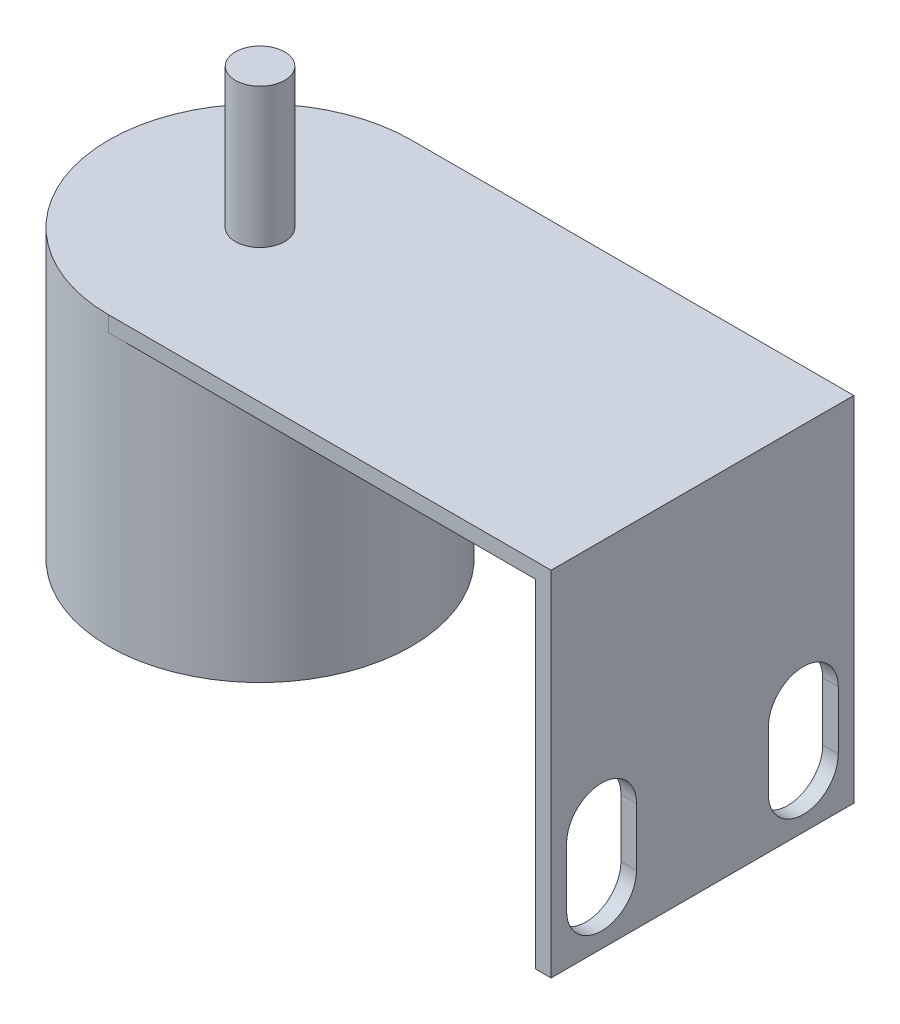
ISO-10303-21;
HEADER;
FILE_DESCRIPTION(('STEP AP214'),'2;1');
FILE_NAME('part.step','',(''),(''),'','','');
FILE_SCHEMA(('AUTOMOTIVE_DESIGN { 1 0 10303 214 1 1 1 1 }'));
ENDSEC;
DATA;
#1=APPLICATION_CONTEXT('core data for automotive mechanical design processes');
#2=APPLICATION_PROTOCOL_DEFINITION('international standard','automotive_design',2000,#1);
#3=PRODUCT_CONTEXT('',#1,'mechanical');
#4=PRODUCT('Part','Part','',(#3));
#5=PRODUCT_RELATED_PRODUCT_CATEGORY('part','',(#4));
#6=PRODUCT_DEFINITION_FORMATION('','',#4);
#7=PRODUCT_DEFINITION_CONTEXT('part definition',#1,'design');
#8=PRODUCT_DEFINITION('design','',#6,#7);
#9=PRODUCT_DEFINITION_SHAPE('','',#8);
#10=(LENGTH_UNIT() NAMED_UNIT(*) SI_UNIT(.MILLI.,.METRE.));
#11=(NAMED_UNIT(*) PLANE_ANGLE_UNIT() SI_UNIT($,.RADIAN.));
#12=(NAMED_UNIT(*) SI_UNIT($,.STERADIAN.) SOLID_ANGLE_UNIT());
#13=UNCERTAINTY_MEASURE_WITH_UNIT(LENGTH_MEASURE(1.E-05),#10,'distance_accuracy_value','');
#14=(GEOMETRIC_REPRESENTATION_CONTEXT(3) GLOBAL_UNCERTAINTY_ASSIGNED_CONTEXT((#13)) GLOBAL_UNIT_ASSIGNED_CONTEXT((#10,
#11,#12)) REPRESENTATION_CONTEXT('',''));
#15=CARTESIAN_POINT('',(0.,0.,0.));
#16=DIRECTION('',(0.,0.,1.));
#17=DIRECTION('',(1.,0.,0.));
#18=AXIS2_PLACEMENT_3D('',#15,#16,#17);
#19=CARTESIAN_POINT('',(0.,35.,0.));
#20=DIRECTION('',(0.,1.,0.));
#21=DIRECTION('',(0.,0.,1.));
#22=AXIS2_PLACEMENT_3D('',#19,#20,#21);
#23=PLANE('',#22);
#24=DIRECTION('',(0.,0.,-1.));
#25=VECTOR('',#24,1.);
#26=CARTESIAN_POINT('',(55.,35.,19.5));
#27=LINE('',#26,#25);
#28=CARTESIAN_POINT('',(55.,35.,19.5));
#29=VERTEX_POINT('',#28);
#30=CARTESIAN_POINT('',(55.,35.,-19.5));
#31=VERTEX_POINT('',#30);
#32=EDGE_CURVE('E169',#29,#31,#27,.T.);
#33=ORIENTED_EDGE('',*,*,#32,.F.);
#34=DIRECTION('',(1.,0.,0.));
#35=VECTOR('',#34,1.);
#36=CARTESIAN_POINT('',(0.,35.,19.5));
#37=LINE('',#36,#35);
#38=CARTESIAN_POINT('',(0.,35.,19.5));
#39=VERTEX_POINT('',#38);
#40=EDGE_CURVE('E206',#39,#29,#37,.T.);
#41=ORIENTED_EDGE('',*,*,#40,.F.);
#42=CARTESIAN_POINT('',(0.,35.,0.));
#43=DIRECTION('',(0.,1.,0.));
#44=DIRECTION('',(0.,0.,1.));
#45=AXIS2_PLACEMENT_3D('',#42,#43,#44);
#46=CIRCLE('',#45,19.5);
#47=CARTESIAN_POINT('',(0.,35.,-19.5));
#48=VERTEX_POINT('',#47);
#49=EDGE_CURVE('E235',#39,#48,#46,.T.);
#50=ORIENTED_EDGE('',*,*,#49,.T.);
#51=DIRECTION('',(-1.,0.,0.));
#52=VECTOR('',#51,1.);
#53=CARTESIAN_POINT('',(0.,35.,-19.5));
#54=LINE('',#53,#52);
#55=EDGE_CURVE('E211',#31,#48,#54,.T.);
#56=ORIENTED_EDGE('',*,*,#55,.F.);
#57=EDGE_LOOP('',(#33,#41,#50,#56));
#58=FACE_BOUND('',#57,.T.);
#59=ADVANCED_FACE('F37',(#58),#23,.F.);
#60=CARTESIAN_POINT('',(0.,35.,0.));
#61=DIRECTION('',(0.,-1.,0.));
#62=DIRECTION('',(0.,0.,-1.));
#63=AXIS2_PLACEMENT_3D('',#60,#61,#62);
#64=CYLINDRICAL_SURFACE('',#63,19.5);
#65=ORIENTED_EDGE('',*,*,#49,.F.);
#66=DIRECTION('',(0.,-1.,0.));
#67=VECTOR('',#66,1.);
#68=CARTESIAN_POINT('',(0.,37.,19.5));
#69=LINE('',#68,#67);
#70=CARTESIAN_POINT('',(0.,37.,19.5));
#71=VERTEX_POINT('',#70);
#72=EDGE_CURVE('E227',#71,#39,#69,.T.);
#73=ORIENTED_EDGE('',*,*,#72,.F.);
#74=CARTESIAN_POINT('',(0.,37.,0.));
#75=DIRECTION('',(0.,1.,0.));
#76=DIRECTION('',(0.,0.,1.));
#77=AXIS2_PLACEMENT_3D('',#74,#75,#76);
#78=CIRCLE('',#77,19.5);
#79=CARTESIAN_POINT('',(0.,37.,-19.5));
#80=VERTEX_POINT('',#79);
#81=EDGE_CURVE('E207',#80,#71,#78,.T.);
#82=ORIENTED_EDGE('',*,*,#81,.F.);
#83=DIRECTION('',(0.,-1.,0.));
#84=VECTOR('',#83,1.);
#85=CARTESIAN_POINT('',(0.,37.,-19.5));
#86=LINE('',#85,#84);
#87=EDGE_CURVE('E217',#80,#48,#86,.T.);
#88=ORIENTED_EDGE('',*,*,#87,.T.);
#89=EDGE_LOOP('',(#65,#73,#82,#88));
#90=FACE_BOUND('',#89,.T.);
#91=CARTESIAN_POINT('',(0.,0.,0.));
#92=DIRECTION('',(0.,1.,0.));
#93=DIRECTION('',(0.,0.,1.));
#94=AXIS2_PLACEMENT_3D('',#91,#92,#93);
#95=CIRCLE('',#94,19.5);
#96=CARTESIAN_POINT('',(0.,0.,19.5));
#97=VERTEX_POINT('',#96);
#98=EDGE_CURVE('E234',#97,#97,#95,.T.);
#99=ORIENTED_EDGE('',*,*,#98,.T.);
#100=EDGE_LOOP('',(#99));
#101=FACE_BOUND('',#100,.T.);
#102=ADVANCED_FACE('F39',(#90,#101),#64,.T.);
#103=CARTESIAN_POINT('',(0.,0.,0.));
#104=DIRECTION('',(0.,1.,0.));
#105=DIRECTION('',(0.,0.,1.));
#106=AXIS2_PLACEMENT_3D('',#103,#104,#105);
#107=PLANE('',#106);
#108=ORIENTED_EDGE('',*,*,#98,.F.);
#109=EDGE_LOOP('',(#108));
#110=FACE_BOUND('',#109,.T.);
#111=ADVANCED_FACE('F283',(#110),#107,.F.);
#112=CARTESIAN_POINT('',(0.,37.,19.5));
#113=DIRECTION('',(0.,0.,-1.));
#114=DIRECTION('',(-1.,0.,0.));
#115=AXIS2_PLACEMENT_3D('',#112,#113,#114);
#116=PLANE('',#115);
#117=ORIENTED_EDGE('',*,*,#40,.T.);
#118=DIRECTION('',(0.,1.,0.));
#119=VECTOR('',#118,1.);
#120=CARTESIAN_POINT('',(55.,-8.49999999999999,19.5));
#121=LINE('',#120,#119);
#122=CARTESIAN_POINT('',(55.,-8.49999999999999,19.5));
#123=VERTEX_POINT('',#122);
#124=EDGE_CURVE('E204',#123,#29,#121,.T.);
#125=ORIENTED_EDGE('',*,*,#124,.F.);
#126=DIRECTION('',(-1.,0.,0.));
#127=VECTOR('',#126,1.);
#128=CARTESIAN_POINT('',(57.,-8.49999999999999,19.5));
#129=LINE('',#128,#127);
#130=CARTESIAN_POINT('',(57.,-8.49999999999999,19.5));
#131=VERTEX_POINT('',#130);
#132=EDGE_CURVE('E193',#131,#123,#129,.T.);
#133=ORIENTED_EDGE('',*,*,#132,.F.);
#134=DIRECTION('',(0.,-1.,0.));
#135=VECTOR('',#134,1.);
#136=CARTESIAN_POINT('',(57.,37.,19.5));
#137=LINE('',#136,#135);
#138=CARTESIAN_POINT('',(57.,37.,19.5));
#139=VERTEX_POINT('',#138);
#140=EDGE_CURVE('E225',#139,#131,#137,.T.);
#141=ORIENTED_EDGE('',*,*,#140,.F.);
#142=DIRECTION('',(1.,0.,0.));
#143=VECTOR('',#142,1.);
#144=CARTESIAN_POINT('',(0.,37.,19.5));
#145=LINE('',#144,#143);
#146=EDGE_CURVE('E210',#71,#139,#145,.T.);
#147=ORIENTED_EDGE('',*,*,#146,.F.);
#148=ORIENTED_EDGE('',*,*,#72,.T.);
#149=EDGE_LOOP('',(#117,#125,#133,#141,#147,#148));
#150=FACE_BOUND('',#149,.T.);
#151=ADVANCED_FACE('F296',(#150),#116,.F.);
#152=CARTESIAN_POINT('',(57.,37.,-19.5));
#153=DIRECTION('',(-1.,0.,0.));
#154=DIRECTION('',(0.,0.,1.));
#155=AXIS2_PLACEMENT_3D('',#152,#153,#154);
#156=PLANE('',#155);
#157=DIRECTION('',(0.,-1.,0.));
#158=VECTOR('',#157,1.);
#159=CARTESIAN_POINT('',(57.,5.50000000000001,17.5));
#160=LINE('',#159,#158);
#161=CARTESIAN_POINT('',(57.,5.50000000000001,17.5));
#162=VERTEX_POINT('',#161);
#163=CARTESIAN_POINT('',(57.,-1.99999999999999,17.5));
#164=VERTEX_POINT('',#163);
#165=EDGE_CURVE('E155',#162,#164,#160,.T.);
#166=ORIENTED_EDGE('',*,*,#165,.F.);
#167=CARTESIAN_POINT('',(57.,5.50000000000001,13.));
#168=DIRECTION('',(1.,0.,0.));
#169=DIRECTION('',(0.,0.,-1.));
#170=AXIS2_PLACEMENT_3D('',#167,#168,#169);
#171=CIRCLE('',#170,4.5);
#172=CARTESIAN_POINT('',(57.,5.50000000000001,8.5));
#173=VERTEX_POINT('',#172);
#174=EDGE_CURVE('E52',#173,#162,#171,.T.);
#175=ORIENTED_EDGE('',*,*,#174,.F.);
#176=DIRECTION('',(0.,1.,0.));
#177=VECTOR('',#176,1.);
#178=CARTESIAN_POINT('',(57.,5.50000000000001,8.5));
#179=LINE('',#178,#177);
#180=CARTESIAN_POINT('',(57.,-1.99999999999999,8.5));
#181=VERTEX_POINT('',#180);
#182=EDGE_CURVE('E162',#181,#173,#179,.T.);
#183=ORIENTED_EDGE('',*,*,#182,.F.);
#184=CARTESIAN_POINT('',(57.,-1.99999999999999,13.));
#185=DIRECTION('',(1.,0.,0.));
#186=DIRECTION('',(0.,0.,-1.));
#187=AXIS2_PLACEMENT_3D('',#184,#185,#186);
#188=CIRCLE('',#187,4.5);
#189=EDGE_CURVE('E145',#164,#181,#188,.T.);
#190=ORIENTED_EDGE('',*,*,#189,.F.);
#191=EDGE_LOOP('',(#166,#175,#183,#190));
#192=FACE_BOUND('',#191,.T.);
#193=DIRECTION('',(0.,-1.,0.));
#194=VECTOR('',#193,1.);
#195=CARTESIAN_POINT('',(57.,5.50000000000001,-8.50000000000002));
#196=LINE('',#195,#194);
#197=CARTESIAN_POINT('',(57.,5.50000000000001,-8.50000000000002));
#198=VERTEX_POINT('',#197);
#199=CARTESIAN_POINT('',(57.,-1.99999999999999,-8.50000000000002));
#200=VERTEX_POINT('',#199);
#201=EDGE_CURVE('E186',#198,#200,#196,.T.);
#202=ORIENTED_EDGE('',*,*,#201,.F.);
#203=CARTESIAN_POINT('',(57.,5.50000000000001,-13.));
#204=DIRECTION('',(1.,0.,0.));
#205=DIRECTION('',(0.,0.,1.));
#206=AXIS2_PLACEMENT_3D('',#203,#204,#205);
#207=CIRCLE('',#206,4.5);
#208=CARTESIAN_POINT('',(57.,5.50000000000001,-17.5));
#209=VERTEX_POINT('',#208);
#210=EDGE_CURVE('E60',#209,#198,#207,.T.);
#211=ORIENTED_EDGE('',*,*,#210,.F.);
#212=DIRECTION('',(0.,1.,0.));
#213=VECTOR('',#212,1.);
#214=CARTESIAN_POINT('',(57.,5.50000000000001,-17.5));
#215=LINE('',#214,#213);
#216=CARTESIAN_POINT('',(57.,-1.99999999999999,-17.5));
#217=VERTEX_POINT('',#216);
#218=EDGE_CURVE('E174',#217,#209,#215,.T.);
#219=ORIENTED_EDGE('',*,*,#218,.F.);
#220=CARTESIAN_POINT('',(57.,-1.99999999999999,-13.));
#221=DIRECTION('',(1.,0.,0.));
#222=DIRECTION('',(0.,0.,1.));
#223=AXIS2_PLACEMENT_3D('',#220,#221,#222);
#224=CIRCLE('',#223,4.5);
#225=EDGE_CURVE('E183',#200,#217,#224,.T.);
#226=ORIENTED_EDGE('',*,*,#225,.F.);
#227=EDGE_LOOP('',(#202,#211,#219,#226));
#228=FACE_BOUND('',#227,.T.);
#229=ORIENTED_EDGE('',*,*,#140,.T.);
#230=DIRECTION('',(0.,0.,1.));
#231=VECTOR('',#230,1.);
#232=CARTESIAN_POINT('',(57.,-8.49999999999999,19.5));
#233=LINE('',#232,#231);
#234=CARTESIAN_POINT('',(57.,-8.49999999999999,-19.5));
#235=VERTEX_POINT('',#234);
#236=EDGE_CURVE('E190',#235,#131,#233,.T.);
#237=ORIENTED_EDGE('',*,*,#236,.F.);
#238=DIRECTION('',(0.,-1.,0.));
#239=VECTOR('',#238,1.);
#240=CARTESIAN_POINT('',(57.,37.,-19.5));
#241=LINE('',#240,#239);
#242=CARTESIAN_POINT('',(57.,37.,-19.5));
#243=VERTEX_POINT('',#242);
#244=EDGE_CURVE('E223',#243,#235,#241,.T.);
#245=ORIENTED_EDGE('',*,*,#244,.F.);
#246=DIRECTION('',(0.,0.,-1.));
#247=VECTOR('',#246,1.);
#248=CARTESIAN_POINT('',(57.,37.,-19.5));
#249=LINE('',#248,#247);
#250=EDGE_CURVE('E213',#139,#243,#249,.T.);
#251=ORIENTED_EDGE('',*,*,#250,.F.);
#252=EDGE_LOOP('',(#229,#237,#245,#251));
#253=FACE_BOUND('',#252,.T.);
#254=ADVANCED_FACE('F159',(#192,#228,#253),#156,.F.);
#255=CARTESIAN_POINT('',(0.,37.,-19.5));
#256=DIRECTION('',(0.,0.,1.));
#257=DIRECTION('',(1.,0.,0.));
#258=AXIS2_PLACEMENT_3D('',#255,#256,#257);
#259=PLANE('',#258);
#260=ORIENTED_EDGE('',*,*,#244,.T.);
#261=DIRECTION('',(1.,0.,0.));
#262=VECTOR('',#261,1.);
#263=CARTESIAN_POINT('',(57.,-8.49999999999999,-19.5));
#264=LINE('',#263,#262);
#265=CARTESIAN_POINT('',(55.,-8.49999999999999,-19.5));
#266=VERTEX_POINT('',#265);
#267=EDGE_CURVE('E197',#266,#235,#264,.T.);
#268=ORIENTED_EDGE('',*,*,#267,.F.);
#269=DIRECTION('',(0.,1.,0.));
#270=VECTOR('',#269,1.);
#271=CARTESIAN_POINT('',(55.,-8.49999999999999,-19.5));
#272=LINE('',#271,#270);
#273=EDGE_CURVE('E200',#266,#31,#272,.T.);
#274=ORIENTED_EDGE('',*,*,#273,.T.);
#275=ORIENTED_EDGE('',*,*,#55,.T.);
#276=ORIENTED_EDGE('',*,*,#87,.F.);
#277=DIRECTION('',(-1.,0.,0.));
#278=VECTOR('',#277,1.);
#279=CARTESIAN_POINT('',(0.,37.,-19.5));
#280=LINE('',#279,#278);
#281=EDGE_CURVE('E215',#243,#80,#280,.T.);
#282=ORIENTED_EDGE('',*,*,#281,.F.);
#283=EDGE_LOOP('',(#260,#268,#274,#275,#276,#282));
#284=FACE_BOUND('',#283,.T.);
#285=ADVANCED_FACE('F290',(#284),#259,.F.);
#286=CARTESIAN_POINT('',(0.,37.,0.));
#287=DIRECTION('',(0.,1.,0.));
#288=DIRECTION('',(0.,0.,1.));
#289=AXIS2_PLACEMENT_3D('',#286,#287,#288);
#290=PLANE('',#289);
#291=CARTESIAN_POINT('',(0.,37.,0.));
#292=DIRECTION('',(0.,1.,0.));
#293=DIRECTION('',(0.,0.,1.));
#294=AXIS2_PLACEMENT_3D('',#291,#292,#293);
#295=CIRCLE('',#294,3.175);
#296=CARTESIAN_POINT('',(0.,37.,3.175));
#297=VERTEX_POINT('',#296);
#298=EDGE_CURVE('E230',#297,#297,#295,.T.);
#299=ORIENTED_EDGE('',*,*,#298,.F.);
#300=EDGE_LOOP('',(#299));
#301=FACE_BOUND('',#300,.T.);
#302=ORIENTED_EDGE('',*,*,#81,.T.);
#303=ORIENTED_EDGE('',*,*,#146,.T.);
#304=ORIENTED_EDGE('',*,*,#250,.T.);
#305=ORIENTED_EDGE('',*,*,#281,.T.);
#306=EDGE_LOOP('',(#302,#303,#304,#305));
#307=FACE_BOUND('',#306,.T.);
#308=ADVANCED_FACE('F288',(#301,#307),#290,.T.);
#309=CARTESIAN_POINT('',(0.,55.,0.));
#310=DIRECTION('',(0.,1.,0.));
#311=DIRECTION('',(0.,0.,1.));
#312=AXIS2_PLACEMENT_3D('',#309,#310,#311);
#313=PLANE('',#312);
#314=CARTESIAN_POINT('',(0.,55.,0.));
#315=DIRECTION('',(0.,1.,0.));
#316=DIRECTION('',(0.,0.,1.));
#317=AXIS2_PLACEMENT_3D('',#314,#315,#316);
#318=CIRCLE('',#317,3.175);
#319=CARTESIAN_POINT('',(0.,55.,3.175));
#320=VERTEX_POINT('',#319);
#321=EDGE_CURVE('E231',#320,#320,#318,.T.);
#322=ORIENTED_EDGE('',*,*,#321,.T.);
#323=EDGE_LOOP('',(#322));
#324=FACE_BOUND('',#323,.T.);
#325=ADVANCED_FACE('F300',(#324),#313,.T.);
#326=CARTESIAN_POINT('',(0.,55.,0.));
#327=DIRECTION('',(0.,-1.,0.));
#328=DIRECTION('',(0.,0.,-1.));
#329=AXIS2_PLACEMENT_3D('',#326,#327,#328);
#330=CYLINDRICAL_SURFACE('',#329,3.175);
#331=ORIENTED_EDGE('',*,*,#298,.T.);
#332=EDGE_LOOP('',(#331));
#333=FACE_BOUND('',#332,.T.);
#334=ORIENTED_EDGE('',*,*,#321,.F.);
#335=EDGE_LOOP('',(#334));
#336=FACE_BOUND('',#335,.T.);
#337=ADVANCED_FACE('F303',(#333,#336),#330,.T.);
#338=CARTESIAN_POINT('',(55.,-8.49999999999999,19.5));
#339=DIRECTION('',(1.,0.,0.));
#340=DIRECTION('',(0.,0.,-1.));
#341=AXIS2_PLACEMENT_3D('',#338,#339,#340);
#342=PLANE('',#341);
#343=DIRECTION('',(0.,1.,0.));
#344=VECTOR('',#343,1.);
#345=CARTESIAN_POINT('',(55.,-8.49999999999999,8.5));
#346=LINE('',#345,#344);
#347=CARTESIAN_POINT('',(55.,-1.99999999999999,8.5));
#348=VERTEX_POINT('',#347);
#349=CARTESIAN_POINT('',(55.,5.50000000000001,8.5));
#350=VERTEX_POINT('',#349);
#351=EDGE_CURVE('E45',#348,#350,#346,.T.);
#352=ORIENTED_EDGE('',*,*,#351,.T.);
#353=CARTESIAN_POINT('',(55.,5.50000000000001,13.));
#354=DIRECTION('',(1.,0.,0.));
#355=DIRECTION('',(0.,0.,-1.));
#356=AXIS2_PLACEMENT_3D('',#353,#354,#355);
#357=CIRCLE('',#356,4.5);
#358=CARTESIAN_POINT('',(55.,5.50000000000001,17.5));
#359=VERTEX_POINT('',#358);
#360=EDGE_CURVE('E11',#350,#359,#357,.T.);
#361=ORIENTED_EDGE('',*,*,#360,.T.);
#362=DIRECTION('',(0.,-1.,0.));
#363=VECTOR('',#362,1.);
#364=CARTESIAN_POINT('',(55.,-8.49999999999999,17.5));
#365=LINE('',#364,#363);
#366=CARTESIAN_POINT('',(55.,-1.99999999999999,17.5));
#367=VERTEX_POINT('',#366);
#368=EDGE_CURVE('E254',#359,#367,#365,.T.);
#369=ORIENTED_EDGE('',*,*,#368,.T.);
#370=CARTESIAN_POINT('',(55.,-1.99999999999999,13.));
#371=DIRECTION('',(1.,0.,0.));
#372=DIRECTION('',(0.,0.,-1.));
#373=AXIS2_PLACEMENT_3D('',#370,#371,#372);
#374=CIRCLE('',#373,4.5);
#375=EDGE_CURVE('E148',#367,#348,#374,.T.);
#376=ORIENTED_EDGE('',*,*,#375,.T.);
#377=EDGE_LOOP('',(#352,#361,#369,#376));
#378=FACE_BOUND('',#377,.T.);
#379=DIRECTION('',(0.,1.,0.));
#380=VECTOR('',#379,1.);
#381=CARTESIAN_POINT('',(55.,-8.49999999999999,-17.5));
#382=LINE('',#381,#380);
#383=CARTESIAN_POINT('',(55.,-1.99999999999999,-17.5));
#384=VERTEX_POINT('',#383);
#385=CARTESIAN_POINT('',(55.,5.50000000000001,-17.5));
#386=VERTEX_POINT('',#385);
#387=EDGE_CURVE('E248',#384,#386,#382,.T.);
#388=ORIENTED_EDGE('',*,*,#387,.T.);
#389=CARTESIAN_POINT('',(55.,5.50000000000001,-13.));
#390=DIRECTION('',(1.,0.,0.));
#391=DIRECTION('',(0.,0.,-1.));
#392=AXIS2_PLACEMENT_3D('',#389,#390,#391);
#393=CIRCLE('',#392,4.5);
#394=CARTESIAN_POINT('',(55.,5.50000000000001,-8.50000000000002));
#395=VERTEX_POINT('',#394);
#396=EDGE_CURVE('E251',#386,#395,#393,.T.);
#397=ORIENTED_EDGE('',*,*,#396,.T.);
#398=DIRECTION('',(0.,-1.,0.));
#399=VECTOR('',#398,1.);
#400=CARTESIAN_POINT('',(55.,-8.49999999999999,-8.50000000000002));
#401=LINE('',#400,#399);
#402=CARTESIAN_POINT('',(55.,-1.99999999999999,-8.50000000000002));
#403=VERTEX_POINT('',#402);
#404=EDGE_CURVE('E238',#395,#403,#401,.T.);
#405=ORIENTED_EDGE('',*,*,#404,.T.);
#406=CARTESIAN_POINT('',(55.,-1.99999999999999,-13.));
#407=DIRECTION('',(1.,0.,0.));
#408=DIRECTION('',(0.,0.,-1.));
#409=AXIS2_PLACEMENT_3D('',#406,#407,#408);
#410=CIRCLE('',#409,4.5);
#411=EDGE_CURVE('E245',#403,#384,#410,.T.);
#412=ORIENTED_EDGE('',*,*,#411,.T.);
#413=EDGE_LOOP('',(#388,#397,#405,#412));
#414=FACE_BOUND('',#413,.T.);
#415=ORIENTED_EDGE('',*,*,#32,.T.);
#416=ORIENTED_EDGE('',*,*,#273,.F.);
#417=DIRECTION('',(0.,0.,-1.));
#418=VECTOR('',#417,1.);
#419=CARTESIAN_POINT('',(55.,-8.49999999999999,19.5));
#420=LINE('',#419,#418);
#421=EDGE_CURVE('E195',#123,#266,#420,.T.);
#422=ORIENTED_EDGE('',*,*,#421,.F.);
#423=ORIENTED_EDGE('',*,*,#124,.T.);
#424=EDGE_LOOP('',(#415,#416,#422,#423));
#425=FACE_BOUND('',#424,.T.);
#426=ADVANCED_FACE('F258',(#378,#414,#425),#342,.F.);
#427=CARTESIAN_POINT('',(0.,-8.49999999999999,0.));
#428=DIRECTION('',(0.,1.,0.));
#429=DIRECTION('',(0.,0.,1.));
#430=AXIS2_PLACEMENT_3D('',#427,#428,#429);
#431=PLANE('',#430);
#432=ORIENTED_EDGE('',*,*,#236,.T.);
#433=ORIENTED_EDGE('',*,*,#132,.T.);
#434=ORIENTED_EDGE('',*,*,#421,.T.);
#435=ORIENTED_EDGE('',*,*,#267,.T.);
#436=EDGE_LOOP('',(#432,#433,#434,#435));
#437=FACE_BOUND('',#436,.T.);
#438=ADVANCED_FACE('F348',(#437),#431,.F.);
#439=CARTESIAN_POINT('',(52.,5.50000000000001,-13.));
#440=DIRECTION('',(1.,0.,0.));
#441=DIRECTION('',(0.,0.,-1.));
#442=AXIS2_PLACEMENT_3D('',#439,#440,#441);
#443=CYLINDRICAL_SURFACE('',#442,4.5);
#444=DIRECTION('',(1.,0.,0.));
#445=VECTOR('',#444,1.);
#446=CARTESIAN_POINT('',(52.,5.50000000000001,-17.5));
#447=LINE('',#446,#445);
#448=EDGE_CURVE('E179',#386,#209,#447,.T.);
#449=ORIENTED_EDGE('',*,*,#448,.T.);
#450=ORIENTED_EDGE('',*,*,#210,.T.);
#451=DIRECTION('',(1.,0.,0.));
#452=VECTOR('',#451,1.);
#453=CARTESIAN_POINT('',(52.,5.50000000000001,-8.50000000000002));
#454=LINE('',#453,#452);
#455=EDGE_CURVE('E172',#395,#198,#454,.T.);
#456=ORIENTED_EDGE('',*,*,#455,.F.);
#457=ORIENTED_EDGE('',*,*,#396,.F.);
#458=EDGE_LOOP('',(#449,#450,#456,#457));
#459=FACE_BOUND('',#458,.T.);
#460=ADVANCED_FACE('F354',(#459),#443,.F.);
#461=CARTESIAN_POINT('',(52.,5.50000000000001,-17.5));
#462=DIRECTION('',(0.,0.,-1.));
#463=DIRECTION('',(-1.,0.,0.));
#464=AXIS2_PLACEMENT_3D('',#461,#462,#463);
#465=PLANE('',#464);
#466=DIRECTION('',(1.,0.,0.));
#467=VECTOR('',#466,1.);
#468=CARTESIAN_POINT('',(52.,-1.99999999999999,-17.5));
#469=LINE('',#468,#467);
#470=EDGE_CURVE('E177',#384,#217,#469,.T.);
#471=ORIENTED_EDGE('',*,*,#470,.T.);
#472=ORIENTED_EDGE('',*,*,#218,.T.);
#473=ORIENTED_EDGE('',*,*,#448,.F.);
#474=ORIENTED_EDGE('',*,*,#387,.F.);
#475=EDGE_LOOP('',(#471,#472,#473,#474));
#476=FACE_BOUND('',#475,.T.);
#477=ADVANCED_FACE('F361',(#476),#465,.F.);
#478=CARTESIAN_POINT('',(52.,-1.99999999999999,-13.));
#479=DIRECTION('',(1.,0.,0.));
#480=DIRECTION('',(0.,0.,-1.));
#481=AXIS2_PLACEMENT_3D('',#478,#479,#480);
#482=CYLINDRICAL_SURFACE('',#481,4.5);
#483=DIRECTION('',(1.,0.,0.));
#484=VECTOR('',#483,1.);
#485=CARTESIAN_POINT('',(52.,-1.99999999999999,-8.50000000000002));
#486=LINE('',#485,#484);
#487=EDGE_CURVE('E175',#403,#200,#486,.T.);
#488=ORIENTED_EDGE('',*,*,#487,.T.);
#489=ORIENTED_EDGE('',*,*,#225,.T.);
#490=ORIENTED_EDGE('',*,*,#470,.F.);
#491=ORIENTED_EDGE('',*,*,#411,.F.);
#492=EDGE_LOOP('',(#488,#489,#490,#491));
#493=FACE_BOUND('',#492,.T.);
#494=ADVANCED_FACE('F272',(#493),#482,.F.);
#495=CARTESIAN_POINT('',(52.,5.50000000000001,-8.50000000000002));
#496=DIRECTION('',(0.,0.,1.));
#497=DIRECTION('',(1.,0.,0.));
#498=AXIS2_PLACEMENT_3D('',#495,#496,#497);
#499=PLANE('',#498);
#500=ORIENTED_EDGE('',*,*,#455,.T.);
#501=ORIENTED_EDGE('',*,*,#201,.T.);
#502=ORIENTED_EDGE('',*,*,#487,.F.);
#503=ORIENTED_EDGE('',*,*,#404,.F.);
#504=EDGE_LOOP('',(#500,#501,#502,#503));
#505=FACE_BOUND('',#504,.T.);
#506=ADVANCED_FACE('F265',(#505),#499,.F.);
#507=CARTESIAN_POINT('',(52.,5.50000000000001,13.));
#508=DIRECTION('',(1.,0.,0.));
#509=DIRECTION('',(0.,0.,-1.));
#510=AXIS2_PLACEMENT_3D('',#507,#508,#509);
#511=CYLINDRICAL_SURFACE('',#510,4.5);
#512=DIRECTION('',(1.,0.,0.));
#513=VECTOR('',#512,1.);
#514=CARTESIAN_POINT('',(52.,5.50000000000001,8.5));
#515=LINE('',#514,#513);
#516=EDGE_CURVE('E167',#350,#173,#515,.T.);
#517=ORIENTED_EDGE('',*,*,#516,.T.);
#518=ORIENTED_EDGE('',*,*,#174,.T.);
#519=DIRECTION('',(1.,0.,0.));
#520=VECTOR('',#519,1.);
#521=CARTESIAN_POINT('',(52.,5.50000000000001,17.5));
#522=LINE('',#521,#520);
#523=EDGE_CURVE('E152',#359,#162,#522,.T.);
#524=ORIENTED_EDGE('',*,*,#523,.F.);
#525=ORIENTED_EDGE('',*,*,#360,.F.);
#526=EDGE_LOOP('',(#517,#518,#524,#525));
#527=FACE_BOUND('',#526,.T.);
#528=ADVANCED_FACE('F263',(#527),#511,.F.);
#529=CARTESIAN_POINT('',(52.,5.50000000000001,8.5));
#530=DIRECTION('',(0.,0.,-1.));
#531=DIRECTION('',(-1.,0.,0.));
#532=AXIS2_PLACEMENT_3D('',#529,#530,#531);
#533=PLANE('',#532);
#534=DIRECTION('',(1.,0.,0.));
#535=VECTOR('',#534,1.);
#536=CARTESIAN_POINT('',(52.,-1.99999999999999,8.5));
#537=LINE('',#536,#535);
#538=EDGE_CURVE('E151',#348,#181,#537,.T.);
#539=ORIENTED_EDGE('',*,*,#538,.T.);
#540=ORIENTED_EDGE('',*,*,#182,.T.);
#541=ORIENTED_EDGE('',*,*,#516,.F.);
#542=ORIENTED_EDGE('',*,*,#351,.F.);
#543=EDGE_LOOP('',(#539,#540,#541,#542));
#544=FACE_BOUND('',#543,.T.);
#545=ADVANCED_FACE('F262',(#544),#533,.F.);
#546=CARTESIAN_POINT('',(52.,-1.99999999999999,13.));
#547=DIRECTION('',(1.,0.,0.));
#548=DIRECTION('',(0.,0.,-1.));
#549=AXIS2_PLACEMENT_3D('',#546,#547,#548);
#550=CYLINDRICAL_SURFACE('',#549,4.5);
#551=DIRECTION('',(1.,0.,0.));
#552=VECTOR('',#551,1.);
#553=CARTESIAN_POINT('',(52.,-1.99999999999999,17.5));
#554=LINE('',#553,#552);
#555=EDGE_CURVE('E140',#367,#164,#554,.T.);
#556=ORIENTED_EDGE('',*,*,#555,.T.);
#557=ORIENTED_EDGE('',*,*,#189,.T.);
#558=ORIENTED_EDGE('',*,*,#538,.F.);
#559=ORIENTED_EDGE('',*,*,#375,.F.);
#560=EDGE_LOOP('',(#556,#557,#558,#559));
#561=FACE_BOUND('',#560,.T.);
#562=ADVANCED_FACE('F142',(#561),#550,.F.);
#563=CARTESIAN_POINT('',(52.,5.50000000000001,17.5));
#564=DIRECTION('',(0.,0.,1.));
#565=DIRECTION('',(1.,0.,0.));
#566=AXIS2_PLACEMENT_3D('',#563,#564,#565);
#567=PLANE('',#566);
#568=ORIENTED_EDGE('',*,*,#523,.T.);
#569=ORIENTED_EDGE('',*,*,#165,.T.);
#570=ORIENTED_EDGE('',*,*,#555,.F.);
#571=ORIENTED_EDGE('',*,*,#368,.F.);
#572=EDGE_LOOP('',(#568,#569,#570,#571));
#573=FACE_BOUND('',#572,.T.);
#574=ADVANCED_FACE('F156',(#573),#567,.F.);
#575=CLOSED_SHELL('',(#59,#102,#111,#151,#254,#285,#308,#325,#337,#426,#438,#460,#477,#494,#506,
#528,#545,#562,#574));
#576=MANIFOLD_SOLID_BREP('B2',#575);
#577=ADVANCED_BREP_SHAPE_REPRESENTATION('',(#18,#576),#14);
#578=SHAPE_DEFINITION_REPRESENTATION(#9,#577);
ENDSEC;
END-ISO-10303-21;
